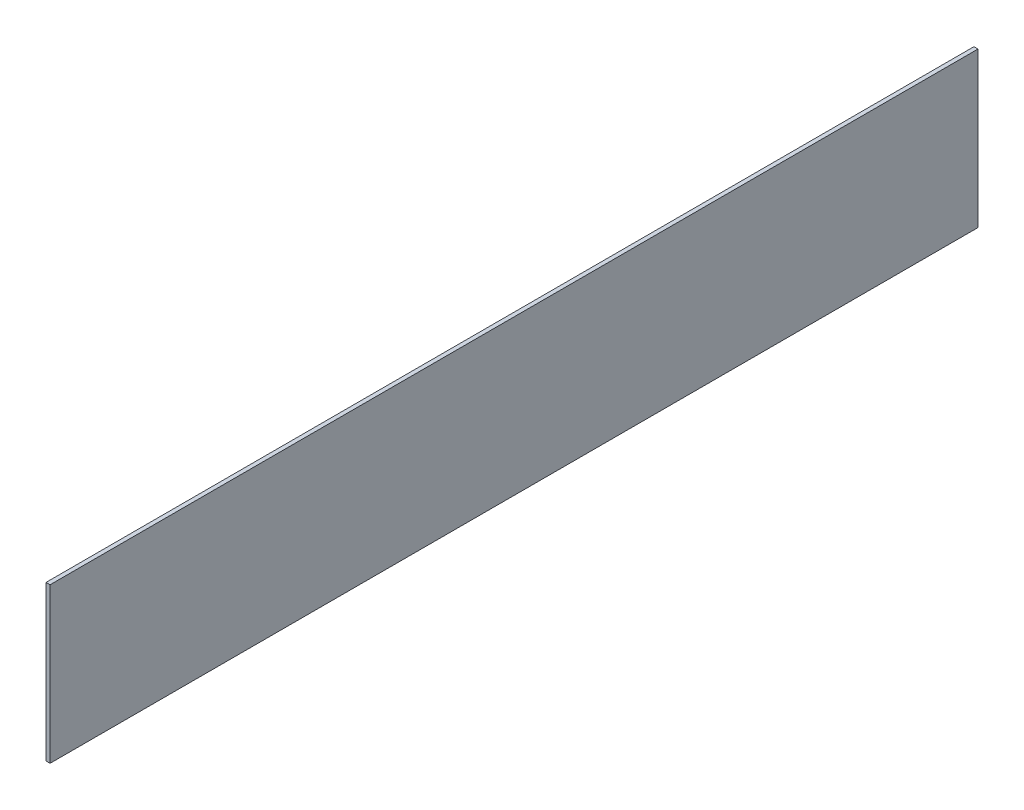
ISO-10303-21;
HEADER;
FILE_DESCRIPTION(('STEP AP214'),'2;1');
FILE_NAME('part.step','',(''),(''),'','','');
FILE_SCHEMA(('AUTOMOTIVE_DESIGN { 1 0 10303 214 1 1 1 1 }'));
ENDSEC;
DATA;
#1=APPLICATION_CONTEXT('core data for automotive mechanical design processes');
#2=APPLICATION_PROTOCOL_DEFINITION('international standard','automotive_design',2000,#1);
#3=PRODUCT_CONTEXT('',#1,'mechanical');
#4=PRODUCT('Part','Part','',(#3));
#5=PRODUCT_RELATED_PRODUCT_CATEGORY('part','',(#4));
#6=PRODUCT_DEFINITION_FORMATION('','',#4);
#7=PRODUCT_DEFINITION_CONTEXT('part definition',#1,'design');
#8=PRODUCT_DEFINITION('design','',#6,#7);
#9=PRODUCT_DEFINITION_SHAPE('','',#8);
#10=(LENGTH_UNIT() NAMED_UNIT(*) SI_UNIT(.MILLI.,.METRE.));
#11=(NAMED_UNIT(*) PLANE_ANGLE_UNIT() SI_UNIT($,.RADIAN.));
#12=(NAMED_UNIT(*) SI_UNIT($,.STERADIAN.) SOLID_ANGLE_UNIT());
#13=UNCERTAINTY_MEASURE_WITH_UNIT(LENGTH_MEASURE(1.E-05),#10,'distance_accuracy_value','');
#14=(GEOMETRIC_REPRESENTATION_CONTEXT(3) GLOBAL_UNCERTAINTY_ASSIGNED_CONTEXT((#13)) GLOBAL_UNIT_ASSIGNED_CONTEXT((#10,
#11,#12)) REPRESENTATION_CONTEXT('',''));
#15=CARTESIAN_POINT('',(0.,0.,0.));
#16=DIRECTION('',(0.,0.,1.));
#17=DIRECTION('',(1.,0.,0.));
#18=AXIS2_PLACEMENT_3D('',#15,#16,#17);
#19=CARTESIAN_POINT('',(2.000000064,38.1,-228.6));
#20=DIRECTION('',(0.,0.,1.));
#21=DIRECTION('',(1.,0.,0.));
#22=AXIS2_PLACEMENT_3D('',#19,#20,#21);
#23=PLANE('',#22);
#24=DIRECTION('',(0.,1.,0.));
#25=VECTOR('',#24,1.);
#26=CARTESIAN_POINT('',(0.,38.1,-228.6));
#27=LINE('',#26,#25);
#28=CARTESIAN_POINT('',(0.,-38.1,-228.6));
#29=VERTEX_POINT('',#28);
#30=CARTESIAN_POINT('',(0.,38.1,-228.6));
#31=VERTEX_POINT('',#30);
#32=EDGE_CURVE('E107',#29,#31,#27,.T.);
#33=ORIENTED_EDGE('',*,*,#32,.T.);
#34=DIRECTION('',(-1.,0.,0.));
#35=VECTOR('',#34,1.);
#36=CARTESIAN_POINT('',(2.000000064,38.1,-228.6));
#37=LINE('',#36,#35);
#38=CARTESIAN_POINT('',(2.000000064,38.1,-228.6));
#39=VERTEX_POINT('',#38);
#40=EDGE_CURVE('E11',#39,#31,#37,.T.);
#41=ORIENTED_EDGE('',*,*,#40,.F.);
#42=DIRECTION('',(0.,1.,0.));
#43=VECTOR('',#42,1.);
#44=CARTESIAN_POINT('',(2.000000064,38.1,-228.6));
#45=LINE('',#44,#43);
#46=CARTESIAN_POINT('',(2.000000064,-38.1,-228.6));
#47=VERTEX_POINT('',#46);
#48=EDGE_CURVE('E91',#47,#39,#45,.T.);
#49=ORIENTED_EDGE('',*,*,#48,.F.);
#50=DIRECTION('',(-1.,0.,0.));
#51=VECTOR('',#50,1.);
#52=CARTESIAN_POINT('',(2.000000064,-38.1,-228.6));
#53=LINE('',#52,#51);
#54=EDGE_CURVE('E103',#47,#29,#53,.T.);
#55=ORIENTED_EDGE('',*,*,#54,.T.);
#56=EDGE_LOOP('',(#33,#41,#49,#55));
#57=FACE_BOUND('',#56,.T.);
#58=ADVANCED_FACE('F39',(#57),#23,.F.);
#59=CARTESIAN_POINT('',(2.000000064,38.1,228.6));
#60=DIRECTION('',(0.,-1.,0.));
#61=DIRECTION('',(0.,0.,-1.));
#62=AXIS2_PLACEMENT_3D('',#59,#60,#61);
#63=PLANE('',#62);
#64=DIRECTION('',(0.,0.,1.));
#65=VECTOR('',#64,1.);
#66=CARTESIAN_POINT('',(0.,38.1,228.6));
#67=LINE('',#66,#65);
#68=CARTESIAN_POINT('',(0.,38.1,228.6));
#69=VERTEX_POINT('',#68);
#70=EDGE_CURVE('E96',#31,#69,#67,.T.);
#71=ORIENTED_EDGE('',*,*,#70,.T.);
#72=DIRECTION('',(-1.,0.,0.));
#73=VECTOR('',#72,1.);
#74=CARTESIAN_POINT('',(2.000000064,38.1,228.6));
#75=LINE('',#74,#73);
#76=CARTESIAN_POINT('',(2.000000064,38.1,228.6));
#77=VERTEX_POINT('',#76);
#78=EDGE_CURVE('E48',#77,#69,#75,.T.);
#79=ORIENTED_EDGE('',*,*,#78,.F.);
#80=DIRECTION('',(0.,0.,1.));
#81=VECTOR('',#80,1.);
#82=CARTESIAN_POINT('',(2.000000064,38.1,228.6));
#83=LINE('',#82,#81);
#84=EDGE_CURVE('E86',#39,#77,#83,.T.);
#85=ORIENTED_EDGE('',*,*,#84,.F.);
#86=ORIENTED_EDGE('',*,*,#40,.T.);
#87=EDGE_LOOP('',(#71,#79,#85,#86));
#88=FACE_BOUND('',#87,.T.);
#89=ADVANCED_FACE('F95',(#88),#63,.F.);
#90=CARTESIAN_POINT('',(2.000000064,38.1,228.6));
#91=DIRECTION('',(0.,0.,-1.));
#92=DIRECTION('',(-1.,0.,0.));
#93=AXIS2_PLACEMENT_3D('',#90,#91,#92);
#94=PLANE('',#93);
#95=DIRECTION('',(0.,-1.,0.));
#96=VECTOR('',#95,1.);
#97=CARTESIAN_POINT('',(0.,38.1,228.6));
#98=LINE('',#97,#96);
#99=CARTESIAN_POINT('',(0.,-38.1,228.6));
#100=VERTEX_POINT('',#99);
#101=EDGE_CURVE('E73',#69,#100,#98,.T.);
#102=ORIENTED_EDGE('',*,*,#101,.T.);
#103=DIRECTION('',(-1.,0.,0.));
#104=VECTOR('',#103,1.);
#105=CARTESIAN_POINT('',(2.000000064,-38.1,228.6));
#106=LINE('',#105,#104);
#107=CARTESIAN_POINT('',(2.000000064,-38.1,228.6));
#108=VERTEX_POINT('',#107);
#109=EDGE_CURVE('E98',#108,#100,#106,.T.);
#110=ORIENTED_EDGE('',*,*,#109,.F.);
#111=DIRECTION('',(0.,-1.,0.));
#112=VECTOR('',#111,1.);
#113=CARTESIAN_POINT('',(2.000000064,38.1,228.6));
#114=LINE('',#113,#112);
#115=EDGE_CURVE('E89',#77,#108,#114,.T.);
#116=ORIENTED_EDGE('',*,*,#115,.F.);
#117=ORIENTED_EDGE('',*,*,#78,.T.);
#118=EDGE_LOOP('',(#102,#110,#116,#117));
#119=FACE_BOUND('',#118,.T.);
#120=ADVANCED_FACE('F99',(#119),#94,.F.);
#121=CARTESIAN_POINT('',(2.000000064,-38.1,228.6));
#122=DIRECTION('',(0.,1.,0.));
#123=DIRECTION('',(0.,0.,1.));
#124=AXIS2_PLACEMENT_3D('',#121,#122,#123);
#125=PLANE('',#124);
#126=DIRECTION('',(0.,0.,-1.));
#127=VECTOR('',#126,1.);
#128=CARTESIAN_POINT('',(0.,-38.1,228.6));
#129=LINE('',#128,#127);
#130=EDGE_CURVE('E79',#100,#29,#129,.T.);
#131=ORIENTED_EDGE('',*,*,#130,.T.);
#132=ORIENTED_EDGE('',*,*,#54,.F.);
#133=DIRECTION('',(0.,0.,-1.));
#134=VECTOR('',#133,1.);
#135=CARTESIAN_POINT('',(2.000000064,-38.1,228.6));
#136=LINE('',#135,#134);
#137=EDGE_CURVE('E56',#108,#47,#136,.T.);
#138=ORIENTED_EDGE('',*,*,#137,.F.);
#139=ORIENTED_EDGE('',*,*,#109,.T.);
#140=EDGE_LOOP('',(#131,#132,#138,#139));
#141=FACE_BOUND('',#140,.T.);
#142=ADVANCED_FACE('F120',(#141),#125,.F.);
#143=CARTESIAN_POINT('',(2.000000064,0.,0.));
#144=DIRECTION('',(1.,0.,0.));
#145=DIRECTION('',(0.,0.,-1.));
#146=AXIS2_PLACEMENT_3D('',#143,#144,#145);
#147=PLANE('',#146);
#148=ORIENTED_EDGE('',*,*,#48,.T.);
#149=ORIENTED_EDGE('',*,*,#84,.T.);
#150=ORIENTED_EDGE('',*,*,#115,.T.);
#151=ORIENTED_EDGE('',*,*,#137,.T.);
#152=EDGE_LOOP('',(#148,#149,#150,#151));
#153=FACE_BOUND('',#152,.T.);
#154=ADVANCED_FACE('F87',(#153),#147,.T.);
#155=CARTESIAN_POINT('',(0.,0.,0.));
#156=DIRECTION('',(1.,0.,0.));
#157=DIRECTION('',(0.,0.,-1.));
#158=AXIS2_PLACEMENT_3D('',#155,#156,#157);
#159=PLANE('',#158);
#160=ORIENTED_EDGE('',*,*,#32,.F.);
#161=ORIENTED_EDGE('',*,*,#130,.F.);
#162=ORIENTED_EDGE('',*,*,#101,.F.);
#163=ORIENTED_EDGE('',*,*,#70,.F.);
#164=EDGE_LOOP('',(#160,#161,#162,#163));
#165=FACE_BOUND('',#164,.T.);
#166=ADVANCED_FACE('F123',(#165),#159,.F.);
#167=CLOSED_SHELL('',(#58,#89,#120,#142,#154,#166));
#168=MANIFOLD_SOLID_BREP('B2',#167);
#169=ADVANCED_BREP_SHAPE_REPRESENTATION('',(#18,#168),#14);
#170=SHAPE_DEFINITION_REPRESENTATION(#9,#169);
ENDSEC;
END-ISO-10303-21;
